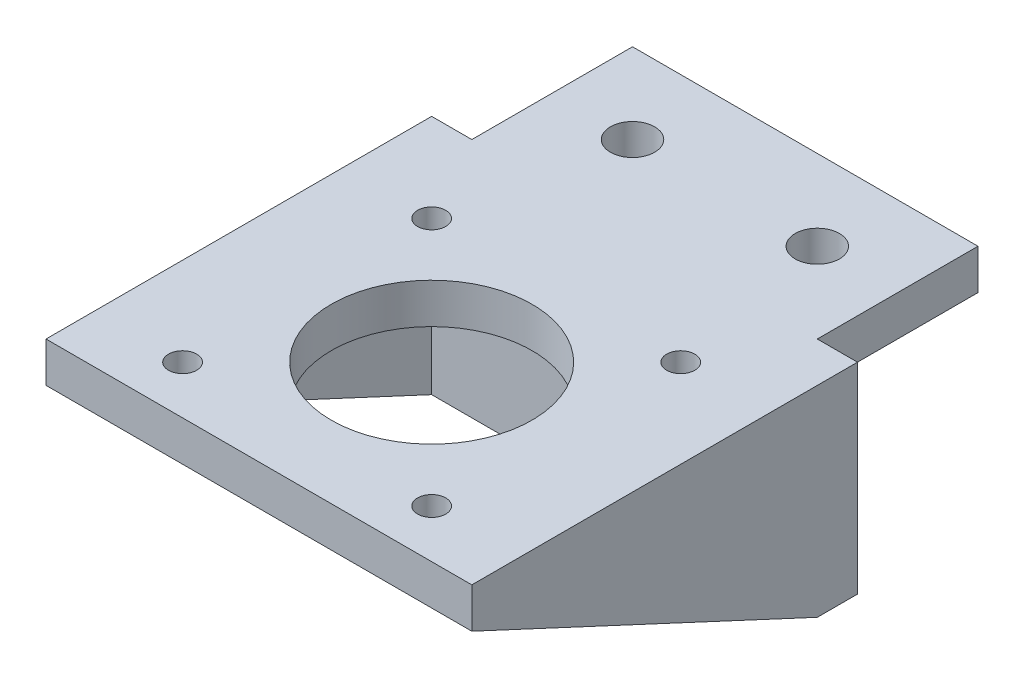
ISO-10303-21;
HEADER;
FILE_DESCRIPTION(('STEP AP214'),'2;1');
FILE_NAME('part.step','',(''),(''),'','','');
FILE_SCHEMA(('AUTOMOTIVE_DESIGN { 1 0 10303 214 1 1 1 1 }'));
ENDSEC;
DATA;
#1=APPLICATION_CONTEXT('core data for automotive mechanical design processes');
#2=APPLICATION_PROTOCOL_DEFINITION('international standard','automotive_design',2000,#1);
#3=PRODUCT_CONTEXT('',#1,'mechanical');
#4=PRODUCT('Part','Part','',(#3));
#5=PRODUCT_RELATED_PRODUCT_CATEGORY('part','',(#4));
#6=PRODUCT_DEFINITION_FORMATION('','',#4);
#7=PRODUCT_DEFINITION_CONTEXT('part definition',#1,'design');
#8=PRODUCT_DEFINITION('design','',#6,#7);
#9=PRODUCT_DEFINITION_SHAPE('','',#8);
#10=(LENGTH_UNIT() NAMED_UNIT(*) SI_UNIT(.MILLI.,.METRE.));
#11=(NAMED_UNIT(*) PLANE_ANGLE_UNIT() SI_UNIT($,.RADIAN.));
#12=(NAMED_UNIT(*) SI_UNIT($,.STERADIAN.) SOLID_ANGLE_UNIT());
#13=UNCERTAINTY_MEASURE_WITH_UNIT(LENGTH_MEASURE(1.E-05),#10,'distance_accuracy_value','');
#14=(GEOMETRIC_REPRESENTATION_CONTEXT(3) GLOBAL_UNCERTAINTY_ASSIGNED_CONTEXT((#13)) GLOBAL_UNIT_ASSIGNED_CONTEXT((#10,
#11,#12)) REPRESENTATION_CONTEXT('',''));
#15=CARTESIAN_POINT('',(0.,0.,0.));
#16=DIRECTION('',(0.,0.,1.));
#17=DIRECTION('',(1.,0.,0.));
#18=AXIS2_PLACEMENT_3D('',#15,#16,#17);
#19=CARTESIAN_POINT('',(-15.123432706951,5.,-10.3824724415128));
#20=DIRECTION('',(1.,0.,0.));
#21=DIRECTION('',(0.,0.,-1.));
#22=AXIS2_PLACEMENT_3D('',#19,#20,#21);
#23=PLANE('',#22);
#24=DIRECTION('',(0.,-1.,0.));
#25=VECTOR('',#24,1.);
#26=CARTESIAN_POINT('',(-15.123432706951,-20.,-15.3824724415128));
#27=LINE('',#26,#25);
#28=CARTESIAN_POINT('',(-15.123432706951,5.,-15.3824724415128));
#29=VERTEX_POINT('',#28);
#30=CARTESIAN_POINT('',(-15.123432706951,0.,-15.3824724415128));
#31=VERTEX_POINT('',#30);
#32=EDGE_CURVE('E58',#29,#31,#27,.T.);
#33=ORIENTED_EDGE('',*,*,#32,.F.);
#34=DIRECTION('',(0.,0.,1.));
#35=VECTOR('',#34,1.);
#36=CARTESIAN_POINT('',(-15.123432706951,5.,-10.3824724415128));
#37=LINE('',#36,#35);
#38=CARTESIAN_POINT('',(-15.123432706951,5.,-35.3824724415128));
#39=VERTEX_POINT('',#38);
#40=EDGE_CURVE('E149',#39,#29,#37,.T.);
#41=ORIENTED_EDGE('',*,*,#40,.F.);
#42=DIRECTION('',(0.,1.,0.));
#43=VECTOR('',#42,1.);
#44=CARTESIAN_POINT('',(-15.123432706951,0.,-35.3824724415128));
#45=LINE('',#44,#43);
#46=CARTESIAN_POINT('',(-15.123432706951,0.,-35.3824724415128));
#47=VERTEX_POINT('',#46);
#48=EDGE_CURVE('E198',#47,#39,#45,.T.);
#49=ORIENTED_EDGE('',*,*,#48,.F.);
#50=DIRECTION('',(0.,0.,1.));
#51=VECTOR('',#50,1.);
#52=CARTESIAN_POINT('',(-15.123432706951,0.,-10.3824724415128));
#53=LINE('',#52,#51);
#54=EDGE_CURVE('E239',#47,#31,#53,.T.);
#55=ORIENTED_EDGE('',*,*,#54,.T.);
#56=EDGE_LOOP('',(#33,#41,#49,#55));
#57=FACE_BOUND('',#56,.T.);
#58=ADVANCED_FACE('F34',(#57),#23,.F.);
#59=CARTESIAN_POINT('',(27.876567293049,5.,-10.3824724415128));
#60=DIRECTION('',(-1.,0.,0.));
#61=DIRECTION('',(0.,0.,1.));
#62=AXIS2_PLACEMENT_3D('',#59,#60,#61);
#63=PLANE('',#62);
#64=DIRECTION('',(0.,1.,0.));
#65=VECTOR('',#64,1.);
#66=CARTESIAN_POINT('',(27.876567293049,-20.,-15.3824724415128));
#67=LINE('',#66,#65);
#68=CARTESIAN_POINT('',(27.876567293049,0.,-15.3824724415128));
#69=VERTEX_POINT('',#68);
#70=CARTESIAN_POINT('',(27.876567293049,5.,-15.3824724415128));
#71=VERTEX_POINT('',#70);
#72=EDGE_CURVE('E11',#69,#71,#67,.T.);
#73=ORIENTED_EDGE('',*,*,#72,.F.);
#74=DIRECTION('',(0.,0.,-1.));
#75=VECTOR('',#74,1.);
#76=CARTESIAN_POINT('',(27.876567293049,0.,-10.3824724415128));
#77=LINE('',#76,#75);
#78=CARTESIAN_POINT('',(27.876567293049,0.,-35.3824724415128));
#79=VERTEX_POINT('',#78);
#80=EDGE_CURVE('E242',#69,#79,#77,.T.);
#81=ORIENTED_EDGE('',*,*,#80,.T.);
#82=DIRECTION('',(0.,-1.,0.));
#83=VECTOR('',#82,1.);
#84=CARTESIAN_POINT('',(27.876567293049,5.,-35.3824724415128));
#85=LINE('',#84,#83);
#86=CARTESIAN_POINT('',(27.876567293049,5.,-35.3824724415128));
#87=VERTEX_POINT('',#86);
#88=EDGE_CURVE('E192',#87,#79,#85,.T.);
#89=ORIENTED_EDGE('',*,*,#88,.F.);
#90=DIRECTION('',(0.,0.,-1.));
#91=VECTOR('',#90,1.);
#92=CARTESIAN_POINT('',(27.876567293049,5.,-10.3824724415128));
#93=LINE('',#92,#91);
#94=EDGE_CURVE('E42',#71,#87,#93,.T.);
#95=ORIENTED_EDGE('',*,*,#94,.F.);
#96=EDGE_LOOP('',(#73,#81,#89,#95));
#97=FACE_BOUND('',#96,.T.);
#98=ADVANCED_FACE('F277',(#97),#63,.F.);
#99=CARTESIAN_POINT('',(0.,0.,0.));
#100=DIRECTION('',(0.,1.,0.));
#101=DIRECTION('',(0.,0.,1.));
#102=AXIS2_PLACEMENT_3D('',#99,#100,#101);
#103=PLANE('',#102);
#104=CARTESIAN_POINT('',(6.37656729304899,0.,11.1175275584872));
#105=DIRECTION('',(0.,1.,0.));
#106=DIRECTION('',(0.,0.,1.));
#107=AXIS2_PLACEMENT_3D('',#104,#105,#106);
#108=CIRCLE('',#107,12.5);
#109=CARTESIAN_POINT('',(6.37656729304899,0.,23.6175275584872));
#110=VERTEX_POINT('',#109);
#111=EDGE_CURVE('E204',#110,#110,#108,.T.);
#112=ORIENTED_EDGE('',*,*,#111,.T.);
#113=EDGE_LOOP('',(#112));
#114=FACE_BOUND('',#113,.T.);
#115=CARTESIAN_POINT('',(-9.12343270695101,0.,-4.3824724415128));
#116=DIRECTION('',(0.,1.,0.));
#117=DIRECTION('',(0.,0.,1.));
#118=AXIS2_PLACEMENT_3D('',#115,#116,#117);
#119=CIRCLE('',#118,1.75);
#120=CARTESIAN_POINT('',(-9.12343270695101,0.,-2.6324724415128));
#121=VERTEX_POINT('',#120);
#122=EDGE_CURVE('E208',#121,#121,#119,.T.);
#123=ORIENTED_EDGE('',*,*,#122,.T.);
#124=EDGE_LOOP('',(#123));
#125=FACE_BOUND('',#124,.T.);
#126=CARTESIAN_POINT('',(21.876567293049,0.,-4.38247244151281));
#127=DIRECTION('',(0.,1.,0.));
#128=DIRECTION('',(0.,0.,1.));
#129=AXIS2_PLACEMENT_3D('',#126,#127,#128);
#130=CIRCLE('',#129,1.75);
#131=CARTESIAN_POINT('',(21.876567293049,0.,-2.63247244151281));
#132=VERTEX_POINT('',#131);
#133=EDGE_CURVE('E214',#132,#132,#130,.T.);
#134=ORIENTED_EDGE('',*,*,#133,.T.);
#135=EDGE_LOOP('',(#134));
#136=FACE_BOUND('',#135,.T.);
#137=CARTESIAN_POINT('',(21.876567293049,0.,26.6175275584872));
#138=DIRECTION('',(0.,1.,0.));
#139=DIRECTION('',(0.,0.,1.));
#140=AXIS2_PLACEMENT_3D('',#137,#138,#139);
#141=CIRCLE('',#140,1.75);
#142=CARTESIAN_POINT('',(21.876567293049,0.,28.3675275584872));
#143=VERTEX_POINT('',#142);
#144=EDGE_CURVE('E220',#143,#143,#141,.T.);
#145=ORIENTED_EDGE('',*,*,#144,.T.);
#146=EDGE_LOOP('',(#145));
#147=FACE_BOUND('',#146,.T.);
#148=CARTESIAN_POINT('',(-9.123432706951,0.,26.6175275584872));
#149=DIRECTION('',(0.,1.,0.));
#150=DIRECTION('',(0.,0.,1.));
#151=AXIS2_PLACEMENT_3D('',#148,#149,#150);
#152=CIRCLE('',#151,1.75);
#153=CARTESIAN_POINT('',(-9.123432706951,0.,28.3675275584872));
#154=VERTEX_POINT('',#153);
#155=EDGE_CURVE('E226',#154,#154,#152,.T.);
#156=ORIENTED_EDGE('',*,*,#155,.T.);
#157=EDGE_LOOP('',(#156));
#158=FACE_BOUND('',#157,.T.);
#159=DIRECTION('',(-1.,0.,0.));
#160=VECTOR('',#159,1.);
#161=CARTESIAN_POINT('',(-15.123432706951,0.,-10.3824724415128));
#162=LINE('',#161,#160);
#163=CARTESIAN_POINT('',(27.876567293049,0.,-10.3824724415128));
#164=VERTEX_POINT('',#163);
#165=CARTESIAN_POINT('',(-15.123432706951,0.,-10.3824724415128));
#166=VERTEX_POINT('',#165);
#167=EDGE_CURVE('E50',#164,#166,#162,.T.);
#168=ORIENTED_EDGE('',*,*,#167,.F.);
#169=CARTESIAN_POINT('',(27.876567293049,0.,32.6175275584872));
#170=VERTEX_POINT('',#169);
#171=EDGE_CURVE('E37',#170,#164,#77,.T.);
#172=ORIENTED_EDGE('',*,*,#171,.F.);
#173=DIRECTION('',(1.,0.,0.));
#174=VECTOR('',#173,1.);
#175=CARTESIAN_POINT('',(-15.123432706951,0.,32.6175275584872));
#176=LINE('',#175,#174);
#177=CARTESIAN_POINT('',(-15.123432706951,0.,32.6175275584872));
#178=VERTEX_POINT('',#177);
#179=EDGE_CURVE('E241',#178,#170,#176,.T.);
#180=ORIENTED_EDGE('',*,*,#179,.F.);
#181=EDGE_CURVE('E232',#166,#178,#53,.T.);
#182=ORIENTED_EDGE('',*,*,#181,.F.);
#183=EDGE_LOOP('',(#168,#172,#180,#182));
#184=FACE_BOUND('',#183,.T.);
#185=ADVANCED_FACE('F256',(#114,#125,#136,#147,#158,#184),#103,.F.);
#186=CARTESIAN_POINT('',(-5.12343270695101,0.,-25.3824724415128));
#187=DIRECTION('',(0.,1.,0.));
#188=DIRECTION('',(0.,0.,1.));
#189=AXIS2_PLACEMENT_3D('',#186,#187,#188);
#190=CIRCLE('',#189,2.75);
#191=CARTESIAN_POINT('',(-5.12343270695101,0.,-22.6324724415128));
#192=VERTEX_POINT('',#191);
#193=EDGE_CURVE('E284',#192,#192,#190,.T.);
#194=ORIENTED_EDGE('',*,*,#193,.T.);
#195=EDGE_LOOP('',(#194));
#196=FACE_BOUND('',#195,.T.);
#197=CARTESIAN_POINT('',(17.876567293049,0.,-25.3824724415128));
#198=DIRECTION('',(0.,1.,0.));
#199=DIRECTION('',(0.,0.,1.));
#200=AXIS2_PLACEMENT_3D('',#197,#198,#199);
#201=CIRCLE('',#200,2.75);
#202=CARTESIAN_POINT('',(17.876567293049,0.,-22.6324724415128));
#203=VERTEX_POINT('',#202);
#204=EDGE_CURVE('E288',#203,#203,#201,.T.);
#205=ORIENTED_EDGE('',*,*,#204,.T.);
#206=EDGE_LOOP('',(#205));
#207=FACE_BOUND('',#206,.T.);
#208=DIRECTION('',(1.,0.,0.));
#209=VECTOR('',#208,1.);
#210=CARTESIAN_POINT('',(-15.123432706951,0.,-15.3824724415128));
#211=LINE('',#210,#209);
#212=EDGE_CURVE('E181',#31,#69,#211,.T.);
#213=ORIENTED_EDGE('',*,*,#212,.F.);
#214=ORIENTED_EDGE('',*,*,#54,.F.);
#215=DIRECTION('',(-1.,0.,0.));
#216=VECTOR('',#215,1.);
#217=CARTESIAN_POINT('',(27.876567293049,0.,-35.3824724415128));
#218=LINE('',#217,#216);
#219=EDGE_CURVE('E195',#79,#47,#218,.T.);
#220=ORIENTED_EDGE('',*,*,#219,.F.);
#221=ORIENTED_EDGE('',*,*,#80,.F.);
#222=EDGE_LOOP('',(#213,#214,#220,#221));
#223=FACE_BOUND('',#222,.T.);
#224=ADVANCED_FACE('F279',(#196,#207,#223),#103,.F.);
#225=CARTESIAN_POINT('',(0.,5.,0.));
#226=DIRECTION('',(0.,1.,0.));
#227=DIRECTION('',(0.,0.,1.));
#228=AXIS2_PLACEMENT_3D('',#225,#226,#227);
#229=PLANE('',#228);
#230=CARTESIAN_POINT('',(-5.12343270695101,5.,-25.3824724415128));
#231=DIRECTION('',(0.,1.,0.));
#232=DIRECTION('',(0.,0.,1.));
#233=AXIS2_PLACEMENT_3D('',#230,#231,#232);
#234=CIRCLE('',#233,2.75);
#235=CARTESIAN_POINT('',(-5.12343270695101,5.,-22.6324724415128));
#236=VERTEX_POINT('',#235);
#237=EDGE_CURVE('E298',#236,#236,#234,.T.);
#238=ORIENTED_EDGE('',*,*,#237,.F.);
#239=EDGE_LOOP('',(#238));
#240=FACE_BOUND('',#239,.T.);
#241=CARTESIAN_POINT('',(17.876567293049,5.,-25.3824724415128));
#242=DIRECTION('',(0.,1.,0.));
#243=DIRECTION('',(0.,0.,1.));
#244=AXIS2_PLACEMENT_3D('',#241,#242,#243);
#245=CIRCLE('',#244,2.75);
#246=CARTESIAN_POINT('',(17.876567293049,5.,-22.6324724415128));
#247=VERTEX_POINT('',#246);
#248=EDGE_CURVE('E299',#247,#247,#245,.T.);
#249=ORIENTED_EDGE('',*,*,#248,.F.);
#250=EDGE_LOOP('',(#249));
#251=FACE_BOUND('',#250,.T.);
#252=CARTESIAN_POINT('',(-9.12343270695101,5.,-4.3824724415128));
#253=DIRECTION('',(0.,1.,0.));
#254=DIRECTION('',(0.,0.,1.));
#255=AXIS2_PLACEMENT_3D('',#252,#253,#254);
#256=CIRCLE('',#255,1.75);
#257=CARTESIAN_POINT('',(-9.12343270695101,5.,-2.6324724415128));
#258=VERTEX_POINT('',#257);
#259=EDGE_CURVE('E211',#258,#258,#256,.T.);
#260=ORIENTED_EDGE('',*,*,#259,.F.);
#261=EDGE_LOOP('',(#260));
#262=FACE_BOUND('',#261,.T.);
#263=CARTESIAN_POINT('',(21.876567293049,5.,26.6175275584872));
#264=DIRECTION('',(0.,1.,0.));
#265=DIRECTION('',(0.,0.,1.));
#266=AXIS2_PLACEMENT_3D('',#263,#264,#265);
#267=CIRCLE('',#266,1.75);
#268=CARTESIAN_POINT('',(21.876567293049,5.,28.3675275584872));
#269=VERTEX_POINT('',#268);
#270=EDGE_CURVE('E223',#269,#269,#267,.T.);
#271=ORIENTED_EDGE('',*,*,#270,.F.);
#272=EDGE_LOOP('',(#271));
#273=FACE_BOUND('',#272,.T.);
#274=ORIENTED_EDGE('',*,*,#40,.T.);
#275=DIRECTION('',(1.,0.,0.));
#276=VECTOR('',#275,1.);
#277=CARTESIAN_POINT('',(-20.123432706951,5.,-15.3824724415128));
#278=LINE('',#277,#276);
#279=CARTESIAN_POINT('',(-20.123432706951,5.,-15.3824724415128));
#280=VERTEX_POINT('',#279);
#281=EDGE_CURVE('E129',#280,#29,#278,.T.);
#282=ORIENTED_EDGE('',*,*,#281,.F.);
#283=DIRECTION('',(0.,0.,-1.));
#284=VECTOR('',#283,1.);
#285=CARTESIAN_POINT('',(-20.123432706951,5.,-15.3824724415128));
#286=LINE('',#285,#284);
#287=CARTESIAN_POINT('',(-20.123432706951,5.,32.6175275584872));
#288=VERTEX_POINT('',#287);
#289=EDGE_CURVE('E135',#288,#280,#286,.T.);
#290=ORIENTED_EDGE('',*,*,#289,.F.);
#291=DIRECTION('',(1.,0.,0.));
#292=VECTOR('',#291,1.);
#293=CARTESIAN_POINT('',(-15.123432706951,5.,32.6175275584872));
#294=LINE('',#293,#292);
#295=CARTESIAN_POINT('',(32.876567293049,5.,32.6175275584872));
#296=VERTEX_POINT('',#295);
#297=EDGE_CURVE('E236',#288,#296,#294,.T.);
#298=ORIENTED_EDGE('',*,*,#297,.T.);
#299=DIRECTION('',(0.,0.,1.));
#300=VECTOR('',#299,1.);
#301=CARTESIAN_POINT('',(32.876567293049,5.,-15.3824724415128));
#302=LINE('',#301,#300);
#303=CARTESIAN_POINT('',(32.876567293049,5.,-15.3824724415128));
#304=VERTEX_POINT('',#303);
#305=EDGE_CURVE('E169',#304,#296,#302,.T.);
#306=ORIENTED_EDGE('',*,*,#305,.F.);
#307=DIRECTION('',(-1.,0.,0.));
#308=VECTOR('',#307,1.);
#309=CARTESIAN_POINT('',(32.876567293049,5.,-15.3824724415128));
#310=LINE('',#309,#308);
#311=EDGE_CURVE('E171',#304,#71,#310,.T.);
#312=ORIENTED_EDGE('',*,*,#311,.T.);
#313=ORIENTED_EDGE('',*,*,#94,.T.);
#314=DIRECTION('',(1.,0.,0.));
#315=VECTOR('',#314,1.);
#316=CARTESIAN_POINT('',(-15.123432706951,5.,-35.3824724415128));
#317=LINE('',#316,#315);
#318=EDGE_CURVE('E201',#39,#87,#317,.T.);
#319=ORIENTED_EDGE('',*,*,#318,.F.);
#320=EDGE_LOOP('',(#274,#282,#290,#298,#306,#312,#313,#319));
#321=FACE_BOUND('',#320,.T.);
#322=CARTESIAN_POINT('',(-9.123432706951,5.,26.6175275584872));
#323=DIRECTION('',(0.,1.,0.));
#324=DIRECTION('',(0.,0.,1.));
#325=AXIS2_PLACEMENT_3D('',#322,#323,#324);
#326=CIRCLE('',#325,1.75);
#327=CARTESIAN_POINT('',(-9.123432706951,5.,28.3675275584872));
#328=VERTEX_POINT('',#327);
#329=EDGE_CURVE('E229',#328,#328,#326,.T.);
#330=ORIENTED_EDGE('',*,*,#329,.F.);
#331=EDGE_LOOP('',(#330));
#332=FACE_BOUND('',#331,.T.);
#333=CARTESIAN_POINT('',(21.876567293049,5.,-4.38247244151281));
#334=DIRECTION('',(0.,1.,0.));
#335=DIRECTION('',(0.,0.,1.));
#336=AXIS2_PLACEMENT_3D('',#333,#334,#335);
#337=CIRCLE('',#336,1.75);
#338=CARTESIAN_POINT('',(21.876567293049,5.,-2.63247244151281));
#339=VERTEX_POINT('',#338);
#340=EDGE_CURVE('E217',#339,#339,#337,.T.);
#341=ORIENTED_EDGE('',*,*,#340,.F.);
#342=EDGE_LOOP('',(#341));
#343=FACE_BOUND('',#342,.T.);
#344=CARTESIAN_POINT('',(6.37656729304899,5.,11.1175275584872));
#345=DIRECTION('',(0.,1.,0.));
#346=DIRECTION('',(0.,0.,1.));
#347=AXIS2_PLACEMENT_3D('',#344,#345,#346);
#348=CIRCLE('',#347,12.5);
#349=CARTESIAN_POINT('',(6.37656729304899,5.,23.6175275584872));
#350=VERTEX_POINT('',#349);
#351=EDGE_CURVE('E205',#350,#350,#348,.T.);
#352=ORIENTED_EDGE('',*,*,#351,.F.);
#353=EDGE_LOOP('',(#352));
#354=FACE_BOUND('',#353,.T.);
#355=ADVANCED_FACE('F146',(#240,#251,#262,#273,#321,#332,#343,#354),#229,.T.);
#356=CARTESIAN_POINT('',(-15.123432706951,5.,32.6175275584872));
#357=DIRECTION('',(0.,0.,-1.));
#358=DIRECTION('',(-1.,0.,0.));
#359=AXIS2_PLACEMENT_3D('',#356,#357,#358);
#360=PLANE('',#359);
#361=ORIENTED_EDGE('',*,*,#179,.T.);
#362=DIRECTION('',(-1.,0.,0.));
#363=VECTOR('',#362,1.);
#364=CARTESIAN_POINT('',(32.876567293049,0.,32.6175275584872));
#365=LINE('',#364,#363);
#366=CARTESIAN_POINT('',(32.876567293049,0.,32.6175275584872));
#367=VERTEX_POINT('',#366);
#368=EDGE_CURVE('E178',#367,#170,#365,.T.);
#369=ORIENTED_EDGE('',*,*,#368,.F.);
#370=DIRECTION('',(0.,-1.,0.));
#371=VECTOR('',#370,1.);
#372=CARTESIAN_POINT('',(32.876567293049,5.,32.6175275584872));
#373=LINE('',#372,#371);
#374=EDGE_CURVE('E154',#296,#367,#373,.T.);
#375=ORIENTED_EDGE('',*,*,#374,.F.);
#376=ORIENTED_EDGE('',*,*,#297,.F.);
#377=DIRECTION('',(0.,1.,0.));
#378=VECTOR('',#377,1.);
#379=CARTESIAN_POINT('',(-20.123432706951,5.,32.6175275584872));
#380=LINE('',#379,#378);
#381=CARTESIAN_POINT('',(-20.123432706951,0.,32.6175275584872));
#382=VERTEX_POINT('',#381);
#383=EDGE_CURVE('E141',#382,#288,#380,.T.);
#384=ORIENTED_EDGE('',*,*,#383,.F.);
#385=DIRECTION('',(1.,0.,0.));
#386=VECTOR('',#385,1.);
#387=CARTESIAN_POINT('',(-20.123432706951,0.,32.6175275584872));
#388=LINE('',#387,#386);
#389=EDGE_CURVE('E156',#382,#178,#388,.T.);
#390=ORIENTED_EDGE('',*,*,#389,.T.);
#391=EDGE_LOOP('',(#361,#369,#375,#376,#384,#390));
#392=FACE_BOUND('',#391,.T.);
#393=ADVANCED_FACE('F272',(#392),#360,.F.);
#394=CARTESIAN_POINT('',(-9.123432706951,5.,26.6175275584872));
#395=DIRECTION('',(0.,-1.,0.));
#396=DIRECTION('',(0.,0.,-1.));
#397=AXIS2_PLACEMENT_3D('',#394,#395,#396);
#398=CYLINDRICAL_SURFACE('',#397,1.75);
#399=ORIENTED_EDGE('',*,*,#329,.T.);
#400=EDGE_LOOP('',(#399));
#401=FACE_BOUND('',#400,.T.);
#402=ORIENTED_EDGE('',*,*,#155,.F.);
#403=EDGE_LOOP('',(#402));
#404=FACE_BOUND('',#403,.T.);
#405=ADVANCED_FACE('F321',(#401,#404),#398,.F.);
#406=CARTESIAN_POINT('',(21.876567293049,5.,26.6175275584872));
#407=DIRECTION('',(0.,-1.,0.));
#408=DIRECTION('',(0.,0.,-1.));
#409=AXIS2_PLACEMENT_3D('',#406,#407,#408);
#410=CYLINDRICAL_SURFACE('',#409,1.75);
#411=ORIENTED_EDGE('',*,*,#270,.T.);
#412=EDGE_LOOP('',(#411));
#413=FACE_BOUND('',#412,.T.);
#414=ORIENTED_EDGE('',*,*,#144,.F.);
#415=EDGE_LOOP('',(#414));
#416=FACE_BOUND('',#415,.T.);
#417=ADVANCED_FACE('F317',(#413,#416),#410,.F.);
#418=CARTESIAN_POINT('',(21.876567293049,5.,-4.38247244151281));
#419=DIRECTION('',(0.,-1.,0.));
#420=DIRECTION('',(0.,0.,-1.));
#421=AXIS2_PLACEMENT_3D('',#418,#419,#420);
#422=CYLINDRICAL_SURFACE('',#421,1.75);
#423=ORIENTED_EDGE('',*,*,#340,.T.);
#424=EDGE_LOOP('',(#423));
#425=FACE_BOUND('',#424,.T.);
#426=ORIENTED_EDGE('',*,*,#133,.F.);
#427=EDGE_LOOP('',(#426));
#428=FACE_BOUND('',#427,.T.);
#429=ADVANCED_FACE('F320',(#425,#428),#422,.F.);
#430=CARTESIAN_POINT('',(-9.12343270695101,5.,-4.3824724415128));
#431=DIRECTION('',(0.,-1.,0.));
#432=DIRECTION('',(0.,0.,-1.));
#433=AXIS2_PLACEMENT_3D('',#430,#431,#432);
#434=CYLINDRICAL_SURFACE('',#433,1.75);
#435=ORIENTED_EDGE('',*,*,#259,.T.);
#436=EDGE_LOOP('',(#435));
#437=FACE_BOUND('',#436,.T.);
#438=ORIENTED_EDGE('',*,*,#122,.F.);
#439=EDGE_LOOP('',(#438));
#440=FACE_BOUND('',#439,.T.);
#441=ADVANCED_FACE('F454',(#437,#440),#434,.F.);
#442=CARTESIAN_POINT('',(6.37656729304899,5.,11.1175275584872));
#443=DIRECTION('',(0.,-1.,0.));
#444=DIRECTION('',(0.,0.,-1.));
#445=AXIS2_PLACEMENT_3D('',#442,#443,#444);
#446=CYLINDRICAL_SURFACE('',#445,12.5);
#447=ORIENTED_EDGE('',*,*,#351,.T.);
#448=EDGE_LOOP('',(#447));
#449=FACE_BOUND('',#448,.T.);
#450=ORIENTED_EDGE('',*,*,#111,.F.);
#451=EDGE_LOOP('',(#450));
#452=FACE_BOUND('',#451,.T.);
#453=ADVANCED_FACE('F451',(#449,#452),#446,.F.);
#454=CARTESIAN_POINT('',(0.,0.,-35.3824724415128));
#455=DIRECTION('',(0.,0.,-1.));
#456=DIRECTION('',(-1.,0.,0.));
#457=AXIS2_PLACEMENT_3D('',#454,#455,#456);
#458=PLANE('',#457);
#459=ORIENTED_EDGE('',*,*,#88,.T.);
#460=ORIENTED_EDGE('',*,*,#219,.T.);
#461=ORIENTED_EDGE('',*,*,#48,.T.);
#462=ORIENTED_EDGE('',*,*,#318,.T.);
#463=EDGE_LOOP('',(#459,#460,#461,#462));
#464=FACE_BOUND('',#463,.T.);
#465=ADVANCED_FACE('F282',(#464),#458,.T.);
#466=CARTESIAN_POINT('',(-15.123432706951,-20.,-15.3824724415128));
#467=DIRECTION('',(0.,0.,1.));
#468=DIRECTION('',(1.,0.,0.));
#469=AXIS2_PLACEMENT_3D('',#466,#467,#468);
#470=PLANE('',#469);
#471=ORIENTED_EDGE('',*,*,#212,.T.);
#472=ORIENTED_EDGE('',*,*,#72,.T.);
#473=ORIENTED_EDGE('',*,*,#311,.F.);
#474=DIRECTION('',(0.,1.,0.));
#475=VECTOR('',#474,1.);
#476=CARTESIAN_POINT('',(32.876567293049,-20.,-15.3824724415128));
#477=LINE('',#476,#475);
#478=CARTESIAN_POINT('',(32.876567293049,-20.,-15.3824724415128));
#479=VERTEX_POINT('',#478);
#480=EDGE_CURVE('E167',#479,#304,#477,.T.);
#481=ORIENTED_EDGE('',*,*,#480,.F.);
#482=DIRECTION('',(1.,0.,0.));
#483=VECTOR('',#482,1.);
#484=CARTESIAN_POINT('',(-15.123432706951,-20.,-15.3824724415128));
#485=LINE('',#484,#483);
#486=CARTESIAN_POINT('',(-20.123432706951,-20.,-15.3824724415128));
#487=VERTEX_POINT('',#486);
#488=EDGE_CURVE('E131',#487,#479,#485,.T.);
#489=ORIENTED_EDGE('',*,*,#488,.F.);
#490=DIRECTION('',(0.,-1.,0.));
#491=VECTOR('',#490,1.);
#492=CARTESIAN_POINT('',(-20.123432706951,-20.,-15.3824724415128));
#493=LINE('',#492,#491);
#494=EDGE_CURVE('E125',#280,#487,#493,.T.);
#495=ORIENTED_EDGE('',*,*,#494,.F.);
#496=ORIENTED_EDGE('',*,*,#281,.T.);
#497=ORIENTED_EDGE('',*,*,#32,.T.);
#498=EDGE_LOOP('',(#471,#472,#473,#481,#489,#495,#496,#497));
#499=FACE_BOUND('',#498,.T.);
#500=ADVANCED_FACE('F127',(#499),#470,.F.);
#501=CARTESIAN_POINT('',(-15.123432706951,-20.,-10.3824724415128));
#502=DIRECTION('',(0.,0.,-1.));
#503=DIRECTION('',(-1.,0.,0.));
#504=AXIS2_PLACEMENT_3D('',#501,#502,#503);
#505=PLANE('',#504);
#506=ORIENTED_EDGE('',*,*,#167,.T.);
#507=DIRECTION('',(0.,1.,0.));
#508=VECTOR('',#507,1.);
#509=CARTESIAN_POINT('',(-15.123432706951,-20.,-10.3824724415128));
#510=LINE('',#509,#508);
#511=CARTESIAN_POINT('',(-15.123432706951,-20.,-10.3824724415128));
#512=VERTEX_POINT('',#511);
#513=EDGE_CURVE('E186',#512,#166,#510,.T.);
#514=ORIENTED_EDGE('',*,*,#513,.F.);
#515=DIRECTION('',(-1.,0.,0.));
#516=VECTOR('',#515,1.);
#517=CARTESIAN_POINT('',(-15.123432706951,-20.,-10.3824724415128));
#518=LINE('',#517,#516);
#519=CARTESIAN_POINT('',(27.876567293049,-20.,-10.3824724415128));
#520=VERTEX_POINT('',#519);
#521=EDGE_CURVE('E183',#520,#512,#518,.T.);
#522=ORIENTED_EDGE('',*,*,#521,.F.);
#523=DIRECTION('',(0.,1.,0.));
#524=VECTOR('',#523,1.);
#525=CARTESIAN_POINT('',(27.876567293049,-20.,-10.3824724415128));
#526=LINE('',#525,#524);
#527=EDGE_CURVE('E190',#520,#164,#526,.T.);
#528=ORIENTED_EDGE('',*,*,#527,.T.);
#529=EDGE_LOOP('',(#506,#514,#522,#528));
#530=FACE_BOUND('',#529,.T.);
#531=ADVANCED_FACE('F262',(#530),#505,.F.);
#532=CARTESIAN_POINT('',(0.,-20.,0.));
#533=DIRECTION('',(0.,-1.,0.));
#534=DIRECTION('',(0.,0.,-1.));
#535=AXIS2_PLACEMENT_3D('',#532,#533,#534);
#536=PLANE('',#535);
#537=ORIENTED_EDGE('',*,*,#521,.T.);
#538=DIRECTION('',(1.,0.,0.));
#539=VECTOR('',#538,1.);
#540=CARTESIAN_POINT('',(-20.123432706951,-20.,-10.3824724415128));
#541=LINE('',#540,#539);
#542=CARTESIAN_POINT('',(-20.123432706951,-20.,-10.3824724415128));
#543=VERTEX_POINT('',#542);
#544=EDGE_CURVE('E151',#543,#512,#541,.T.);
#545=ORIENTED_EDGE('',*,*,#544,.F.);
#546=DIRECTION('',(0.,0.,1.));
#547=VECTOR('',#546,1.);
#548=CARTESIAN_POINT('',(-20.123432706951,-20.,-10.3824724415128));
#549=LINE('',#548,#547);
#550=EDGE_CURVE('E134',#487,#543,#549,.T.);
#551=ORIENTED_EDGE('',*,*,#550,.F.);
#552=ORIENTED_EDGE('',*,*,#488,.T.);
#553=DIRECTION('',(0.,0.,-1.));
#554=VECTOR('',#553,1.);
#555=CARTESIAN_POINT('',(32.876567293049,-20.,-10.3824724415128));
#556=LINE('',#555,#554);
#557=CARTESIAN_POINT('',(32.876567293049,-20.,-10.3824724415128));
#558=VERTEX_POINT('',#557);
#559=EDGE_CURVE('E164',#558,#479,#556,.T.);
#560=ORIENTED_EDGE('',*,*,#559,.F.);
#561=DIRECTION('',(-1.,0.,0.));
#562=VECTOR('',#561,1.);
#563=CARTESIAN_POINT('',(32.876567293049,-20.,-10.3824724415128));
#564=LINE('',#563,#562);
#565=EDGE_CURVE('E175',#558,#520,#564,.T.);
#566=ORIENTED_EDGE('',*,*,#565,.T.);
#567=EDGE_LOOP('',(#537,#545,#551,#552,#560,#566));
#568=FACE_BOUND('',#567,.T.);
#569=ADVANCED_FACE('F265',(#568),#536,.T.);
#570=CARTESIAN_POINT('',(27.876567293049,0.,0.));
#571=DIRECTION('',(1.,0.,0.));
#572=DIRECTION('',(0.,0.,-1.));
#573=AXIS2_PLACEMENT_3D('',#570,#571,#572);
#574=PLANE('',#573);
#575=DIRECTION('',(0.,-0.421730749715585,-0.906721111888507));
#576=VECTOR('',#575,1.);
#577=CARTESIAN_POINT('',(27.876567293049,0.,32.6175275584872));
#578=LINE('',#577,#576);
#579=EDGE_CURVE('E150',#170,#520,#578,.T.);
#580=ORIENTED_EDGE('',*,*,#579,.F.);
#581=ORIENTED_EDGE('',*,*,#171,.T.);
#582=ORIENTED_EDGE('',*,*,#527,.F.);
#583=EDGE_LOOP('',(#580,#581,#582));
#584=FACE_BOUND('',#583,.T.);
#585=ADVANCED_FACE('F255',(#584),#574,.F.);
#586=CARTESIAN_POINT('',(32.876567293049,0.,32.6175275584872));
#587=DIRECTION('',(0.,0.906721111888507,-0.421730749715585));
#588=DIRECTION('',(0.,0.421730749715585,0.906721111888507));
#589=AXIS2_PLACEMENT_3D('',#586,#587,#588);
#590=PLANE('',#589);
#591=ORIENTED_EDGE('',*,*,#579,.T.);
#592=ORIENTED_EDGE('',*,*,#565,.F.);
#593=DIRECTION('',(0.,-0.421730749715585,-0.906721111888507));
#594=VECTOR('',#593,1.);
#595=CARTESIAN_POINT('',(32.876567293049,0.,32.6175275584872));
#596=LINE('',#595,#594);
#597=EDGE_CURVE('E162',#367,#558,#596,.T.);
#598=ORIENTED_EDGE('',*,*,#597,.F.);
#599=ORIENTED_EDGE('',*,*,#368,.T.);
#600=EDGE_LOOP('',(#591,#592,#598,#599));
#601=FACE_BOUND('',#600,.T.);
#602=ADVANCED_FACE('F270',(#601),#590,.F.);
#603=CARTESIAN_POINT('',(32.876567293049,0.,0.));
#604=DIRECTION('',(1.,0.,0.));
#605=DIRECTION('',(0.,0.,-1.));
#606=AXIS2_PLACEMENT_3D('',#603,#604,#605);
#607=PLANE('',#606);
#608=ORIENTED_EDGE('',*,*,#374,.T.);
#609=ORIENTED_EDGE('',*,*,#597,.T.);
#610=ORIENTED_EDGE('',*,*,#559,.T.);
#611=ORIENTED_EDGE('',*,*,#480,.T.);
#612=ORIENTED_EDGE('',*,*,#305,.T.);
#613=EDGE_LOOP('',(#608,#609,#610,#611,#612));
#614=FACE_BOUND('',#613,.T.);
#615=ADVANCED_FACE('F274',(#614),#607,.T.);
#616=CARTESIAN_POINT('',(-20.123432706951,0.,32.6175275584872));
#617=DIRECTION('',(0.,0.906721111888507,-0.421730749715585));
#618=DIRECTION('',(0.,0.421730749715585,0.906721111888507));
#619=AXIS2_PLACEMENT_3D('',#616,#617,#618);
#620=PLANE('',#619);
#621=DIRECTION('',(0.,0.421730749715585,0.906721111888507));
#622=VECTOR('',#621,1.);
#623=CARTESIAN_POINT('',(-15.123432706951,0.,32.6175275584872));
#624=LINE('',#623,#622);
#625=EDGE_CURVE('E143',#512,#178,#624,.T.);
#626=ORIENTED_EDGE('',*,*,#625,.T.);
#627=ORIENTED_EDGE('',*,*,#389,.F.);
#628=DIRECTION('',(0.,0.421730749715585,0.906721111888507));
#629=VECTOR('',#628,1.);
#630=CARTESIAN_POINT('',(-20.123432706951,0.,32.6175275584872));
#631=LINE('',#630,#629);
#632=EDGE_CURVE('E293',#543,#382,#631,.T.);
#633=ORIENTED_EDGE('',*,*,#632,.F.);
#634=ORIENTED_EDGE('',*,*,#544,.T.);
#635=EDGE_LOOP('',(#626,#627,#633,#634));
#636=FACE_BOUND('',#635,.T.);
#637=ADVANCED_FACE('F403',(#636),#620,.F.);
#638=CARTESIAN_POINT('',(-20.123432706951,0.,0.));
#639=DIRECTION('',(1.,0.,0.));
#640=DIRECTION('',(0.,0.,-1.));
#641=AXIS2_PLACEMENT_3D('',#638,#639,#640);
#642=PLANE('',#641);
#643=ORIENTED_EDGE('',*,*,#289,.T.);
#644=ORIENTED_EDGE('',*,*,#494,.T.);
#645=ORIENTED_EDGE('',*,*,#550,.T.);
#646=ORIENTED_EDGE('',*,*,#632,.T.);
#647=ORIENTED_EDGE('',*,*,#383,.T.);
#648=EDGE_LOOP('',(#643,#644,#645,#646,#647));
#649=FACE_BOUND('',#648,.T.);
#650=ADVANCED_FACE('F139',(#649),#642,.F.);
#651=CARTESIAN_POINT('',(-15.123432706951,0.,0.));
#652=DIRECTION('',(1.,0.,0.));
#653=DIRECTION('',(0.,0.,-1.));
#654=AXIS2_PLACEMENT_3D('',#651,#652,#653);
#655=PLANE('',#654);
#656=ORIENTED_EDGE('',*,*,#625,.F.);
#657=ORIENTED_EDGE('',*,*,#513,.T.);
#658=ORIENTED_EDGE('',*,*,#181,.T.);
#659=EDGE_LOOP('',(#656,#657,#658));
#660=FACE_BOUND('',#659,.T.);
#661=ADVANCED_FACE('F416',(#660),#655,.T.);
#662=CARTESIAN_POINT('',(17.876567293049,-20.,-25.3824724415128));
#663=DIRECTION('',(0.,1.,0.));
#664=DIRECTION('',(0.,0.,1.));
#665=AXIS2_PLACEMENT_3D('',#662,#663,#664);
#666=CYLINDRICAL_SURFACE('',#665,2.75);
#667=ORIENTED_EDGE('',*,*,#248,.T.);
#668=EDGE_LOOP('',(#667));
#669=FACE_BOUND('',#668,.T.);
#670=ORIENTED_EDGE('',*,*,#204,.F.);
#671=EDGE_LOOP('',(#670));
#672=FACE_BOUND('',#671,.T.);
#673=ADVANCED_FACE('F424',(#669,#672),#666,.F.);
#674=CARTESIAN_POINT('',(-5.12343270695101,-20.,-25.3824724415128));
#675=DIRECTION('',(0.,1.,0.));
#676=DIRECTION('',(0.,0.,1.));
#677=AXIS2_PLACEMENT_3D('',#674,#675,#676);
#678=CYLINDRICAL_SURFACE('',#677,2.75);
#679=ORIENTED_EDGE('',*,*,#237,.T.);
#680=EDGE_LOOP('',(#679));
#681=FACE_BOUND('',#680,.T.);
#682=ORIENTED_EDGE('',*,*,#193,.F.);
#683=EDGE_LOOP('',(#682));
#684=FACE_BOUND('',#683,.T.);
#685=ADVANCED_FACE('F305',(#681,#684),#678,.F.);
#686=CLOSED_SHELL('',(#58,#98,#185,#224,#355,#393,#405,#417,#429,#441,#453,#465,#500,#531,#569,
#585,#602,#615,#637,#650,#661,#673,#685));
#687=MANIFOLD_SOLID_BREP('B2',#686);
#688=ADVANCED_BREP_SHAPE_REPRESENTATION('',(#18,#687),#14);
#689=SHAPE_DEFINITION_REPRESENTATION(#9,#688);
ENDSEC;
END-ISO-10303-21;
